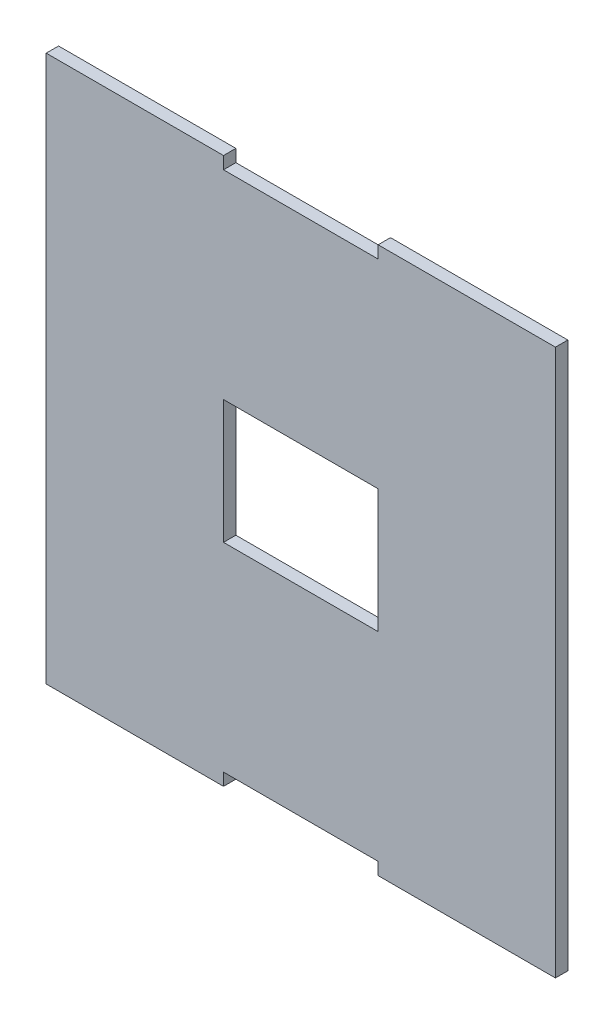
ISO-10303-21;
HEADER;
FILE_DESCRIPTION(('STEP AP214'),'2;1');
FILE_NAME('part.step','',(''),(''),'','','');
FILE_SCHEMA(('AUTOMOTIVE_DESIGN { 1 0 10303 214 1 1 1 1 }'));
ENDSEC;
DATA;
#1=APPLICATION_CONTEXT('core data for automotive mechanical design processes');
#2=APPLICATION_PROTOCOL_DEFINITION('international standard','automotive_design',2000,#1);
#3=PRODUCT_CONTEXT('',#1,'mechanical');
#4=PRODUCT('Part','Part','',(#3));
#5=PRODUCT_RELATED_PRODUCT_CATEGORY('part','',(#4));
#6=PRODUCT_DEFINITION_FORMATION('','',#4);
#7=PRODUCT_DEFINITION_CONTEXT('part definition',#1,'design');
#8=PRODUCT_DEFINITION('design','',#6,#7);
#9=PRODUCT_DEFINITION_SHAPE('','',#8);
#10=(LENGTH_UNIT() NAMED_UNIT(*) SI_UNIT(.MILLI.,.METRE.));
#11=(NAMED_UNIT(*) PLANE_ANGLE_UNIT() SI_UNIT($,.RADIAN.));
#12=(NAMED_UNIT(*) SI_UNIT($,.STERADIAN.) SOLID_ANGLE_UNIT());
#13=UNCERTAINTY_MEASURE_WITH_UNIT(LENGTH_MEASURE(1.E-05),#10,'distance_accuracy_value','');
#14=(GEOMETRIC_REPRESENTATION_CONTEXT(3) GLOBAL_UNCERTAINTY_ASSIGNED_CONTEXT((#13)) GLOBAL_UNIT_ASSIGNED_CONTEXT((#10,
#11,#12)) REPRESENTATION_CONTEXT('',''));
#15=CARTESIAN_POINT('',(0.,0.,0.));
#16=DIRECTION('',(0.,0.,1.));
#17=DIRECTION('',(1.,0.,0.));
#18=AXIS2_PLACEMENT_3D('',#15,#16,#17);
#19=CARTESIAN_POINT('',(0.,0.,6.));
#20=DIRECTION('',(0.,0.,-1.));
#21=DIRECTION('',(-1.,0.,0.));
#22=AXIS2_PLACEMENT_3D('',#19,#20,#21);
#23=PLANE('',#22);
#24=DIRECTION('',(0.,-1.,0.));
#25=VECTOR('',#24,1.);
#26=CARTESIAN_POINT('',(0.,0.,6.));
#27=LINE('',#26,#25);
#28=CARTESIAN_POINT('',(0.,265.,6.));
#29=VERTEX_POINT('',#28);
#30=CARTESIAN_POINT('',(0.,0.,6.));
#31=VERTEX_POINT('',#30);
#32=EDGE_CURVE('E201',#29,#31,#27,.T.);
#33=ORIENTED_EDGE('',*,*,#32,.T.);
#34=DIRECTION('',(1.,0.,0.));
#35=VECTOR('',#34,1.);
#36=CARTESIAN_POINT('',(0.,0.,6.));
#37=LINE('',#36,#35);
#38=CARTESIAN_POINT('',(86.,0.,6.));
#39=VERTEX_POINT('',#38);
#40=EDGE_CURVE('E205',#31,#39,#37,.T.);
#41=ORIENTED_EDGE('',*,*,#40,.T.);
#42=DIRECTION('',(0.,1.,0.));
#43=VECTOR('',#42,1.);
#44=CARTESIAN_POINT('',(86.,0.,6.));
#45=LINE('',#44,#43);
#46=CARTESIAN_POINT('',(86.,6.,6.));
#47=VERTEX_POINT('',#46);
#48=EDGE_CURVE('E209',#39,#47,#45,.T.);
#49=ORIENTED_EDGE('',*,*,#48,.T.);
#50=DIRECTION('',(1.,0.,0.));
#51=VECTOR('',#50,1.);
#52=CARTESIAN_POINT('',(86.,6.,6.));
#53=LINE('',#52,#51);
#54=CARTESIAN_POINT('',(161.,6.,6.));
#55=VERTEX_POINT('',#54);
#56=EDGE_CURVE('E212',#47,#55,#53,.T.);
#57=ORIENTED_EDGE('',*,*,#56,.T.);
#58=DIRECTION('',(0.,-1.,0.));
#59=VECTOR('',#58,1.);
#60=CARTESIAN_POINT('',(161.,0.,6.));
#61=LINE('',#60,#59);
#62=CARTESIAN_POINT('',(161.,0.,6.));
#63=VERTEX_POINT('',#62);
#64=EDGE_CURVE('E215',#55,#63,#61,.T.);
#65=ORIENTED_EDGE('',*,*,#64,.T.);
#66=DIRECTION('',(1.,0.,0.));
#67=VECTOR('',#66,1.);
#68=CARTESIAN_POINT('',(161.,0.,6.));
#69=LINE('',#68,#67);
#70=CARTESIAN_POINT('',(247.,0.,6.));
#71=VERTEX_POINT('',#70);
#72=EDGE_CURVE('E218',#63,#71,#69,.T.);
#73=ORIENTED_EDGE('',*,*,#72,.T.);
#74=DIRECTION('',(0.,1.,0.));
#75=VECTOR('',#74,1.);
#76=CARTESIAN_POINT('',(247.,0.,6.));
#77=LINE('',#76,#75);
#78=CARTESIAN_POINT('',(247.,265.,6.));
#79=VERTEX_POINT('',#78);
#80=EDGE_CURVE('E221',#71,#79,#77,.T.);
#81=ORIENTED_EDGE('',*,*,#80,.T.);
#82=DIRECTION('',(-1.,0.,0.));
#83=VECTOR('',#82,1.);
#84=CARTESIAN_POINT('',(161.,265.,6.));
#85=LINE('',#84,#83);
#86=CARTESIAN_POINT('',(161.,265.,6.));
#87=VERTEX_POINT('',#86);
#88=EDGE_CURVE('E224',#79,#87,#85,.T.);
#89=ORIENTED_EDGE('',*,*,#88,.T.);
#90=DIRECTION('',(0.,-1.,0.));
#91=VECTOR('',#90,1.);
#92=CARTESIAN_POINT('',(161.,265.,6.));
#93=LINE('',#92,#91);
#94=CARTESIAN_POINT('',(161.,259.,6.));
#95=VERTEX_POINT('',#94);
#96=EDGE_CURVE('E227',#87,#95,#93,.T.);
#97=ORIENTED_EDGE('',*,*,#96,.T.);
#98=DIRECTION('',(-1.,0.,0.));
#99=VECTOR('',#98,1.);
#100=CARTESIAN_POINT('',(86.,259.,6.));
#101=LINE('',#100,#99);
#102=CARTESIAN_POINT('',(86.,259.,6.));
#103=VERTEX_POINT('',#102);
#104=EDGE_CURVE('E230',#95,#103,#101,.T.);
#105=ORIENTED_EDGE('',*,*,#104,.T.);
#106=DIRECTION('',(0.,1.,0.));
#107=VECTOR('',#106,1.);
#108=CARTESIAN_POINT('',(86.,265.,6.));
#109=LINE('',#108,#107);
#110=CARTESIAN_POINT('',(86.,265.,6.));
#111=VERTEX_POINT('',#110);
#112=EDGE_CURVE('E233',#103,#111,#109,.T.);
#113=ORIENTED_EDGE('',*,*,#112,.T.);
#114=DIRECTION('',(-1.,0.,0.));
#115=VECTOR('',#114,1.);
#116=CARTESIAN_POINT('',(0.,265.,6.));
#117=LINE('',#116,#115);
#118=EDGE_CURVE('E236',#111,#29,#117,.T.);
#119=ORIENTED_EDGE('',*,*,#118,.T.);
#120=EDGE_LOOP('',(#33,#41,#49,#57,#65,#73,#81,#89,#97,#105,#113,#119));
#121=FACE_BOUND('',#120,.T.);
#122=DIRECTION('',(0.,-1.,0.));
#123=VECTOR('',#122,1.);
#124=CARTESIAN_POINT('',(86.,102.5,6.));
#125=LINE('',#124,#123);
#126=CARTESIAN_POINT('',(86.,162.5,6.));
#127=VERTEX_POINT('',#126);
#128=CARTESIAN_POINT('',(86.,102.5,6.));
#129=VERTEX_POINT('',#128);
#130=EDGE_CURVE('E153',#127,#129,#125,.T.);
#131=ORIENTED_EDGE('',*,*,#130,.F.);
#132=DIRECTION('',(-1.,0.,0.));
#133=VECTOR('',#132,1.);
#134=CARTESIAN_POINT('',(86.,162.5,6.));
#135=LINE('',#134,#133);
#136=CARTESIAN_POINT('',(161.,162.5,6.));
#137=VERTEX_POINT('',#136);
#138=EDGE_CURVE('E179',#137,#127,#135,.T.);
#139=ORIENTED_EDGE('',*,*,#138,.F.);
#140=DIRECTION('',(0.,1.,0.));
#141=VECTOR('',#140,1.);
#142=CARTESIAN_POINT('',(161.,102.5,6.));
#143=LINE('',#142,#141);
#144=CARTESIAN_POINT('',(161.,102.5,6.));
#145=VERTEX_POINT('',#144);
#146=EDGE_CURVE('E175',#145,#137,#143,.T.);
#147=ORIENTED_EDGE('',*,*,#146,.F.);
#148=DIRECTION('',(1.,0.,0.));
#149=VECTOR('',#148,1.);
#150=CARTESIAN_POINT('',(86.,102.5,6.));
#151=LINE('',#150,#149);
#152=EDGE_CURVE('E162',#129,#145,#151,.T.);
#153=ORIENTED_EDGE('',*,*,#152,.F.);
#154=EDGE_LOOP('',(#131,#139,#147,#153));
#155=FACE_BOUND('',#154,.T.);
#156=ADVANCED_FACE('F39',(#121,#155),#23,.F.);
#157=CARTESIAN_POINT('',(0.,0.,0.));
#158=DIRECTION('',(0.,0.,-1.));
#159=DIRECTION('',(-1.,0.,0.));
#160=AXIS2_PLACEMENT_3D('',#157,#158,#159);
#161=PLANE('',#160);
#162=DIRECTION('',(0.,-1.,0.));
#163=VECTOR('',#162,1.);
#164=CARTESIAN_POINT('',(0.,0.,0.));
#165=LINE('',#164,#163);
#166=CARTESIAN_POINT('',(0.,265.,0.));
#167=VERTEX_POINT('',#166);
#168=CARTESIAN_POINT('',(0.,0.,0.));
#169=VERTEX_POINT('',#168);
#170=EDGE_CURVE('E171',#167,#169,#165,.T.);
#171=ORIENTED_EDGE('',*,*,#170,.F.);
#172=DIRECTION('',(-1.,0.,0.));
#173=VECTOR('',#172,1.);
#174=CARTESIAN_POINT('',(0.,265.,0.));
#175=LINE('',#174,#173);
#176=CARTESIAN_POINT('',(86.,265.,0.));
#177=VERTEX_POINT('',#176);
#178=EDGE_CURVE('E206',#177,#167,#175,.T.);
#179=ORIENTED_EDGE('',*,*,#178,.F.);
#180=DIRECTION('',(0.,1.,0.));
#181=VECTOR('',#180,1.);
#182=CARTESIAN_POINT('',(86.,265.,0.));
#183=LINE('',#182,#181);
#184=CARTESIAN_POINT('',(86.,259.,0.));
#185=VERTEX_POINT('',#184);
#186=EDGE_CURVE('E270',#185,#177,#183,.T.);
#187=ORIENTED_EDGE('',*,*,#186,.F.);
#188=DIRECTION('',(-1.,0.,0.));
#189=VECTOR('',#188,1.);
#190=CARTESIAN_POINT('',(86.,259.,0.));
#191=LINE('',#190,#189);
#192=CARTESIAN_POINT('',(161.,259.,0.));
#193=VERTEX_POINT('',#192);
#194=EDGE_CURVE('E267',#193,#185,#191,.T.);
#195=ORIENTED_EDGE('',*,*,#194,.F.);
#196=DIRECTION('',(0.,-1.,0.));
#197=VECTOR('',#196,1.);
#198=CARTESIAN_POINT('',(161.,265.,0.));
#199=LINE('',#198,#197);
#200=CARTESIAN_POINT('',(161.,265.,0.));
#201=VERTEX_POINT('',#200);
#202=EDGE_CURVE('E264',#201,#193,#199,.T.);
#203=ORIENTED_EDGE('',*,*,#202,.F.);
#204=DIRECTION('',(-1.,0.,0.));
#205=VECTOR('',#204,1.);
#206=CARTESIAN_POINT('',(161.,265.,0.));
#207=LINE('',#206,#205);
#208=CARTESIAN_POINT('',(247.,265.,0.));
#209=VERTEX_POINT('',#208);
#210=EDGE_CURVE('E261',#209,#201,#207,.T.);
#211=ORIENTED_EDGE('',*,*,#210,.F.);
#212=DIRECTION('',(0.,1.,0.));
#213=VECTOR('',#212,1.);
#214=CARTESIAN_POINT('',(247.,0.,0.));
#215=LINE('',#214,#213);
#216=CARTESIAN_POINT('',(247.,0.,0.));
#217=VERTEX_POINT('',#216);
#218=EDGE_CURVE('E258',#217,#209,#215,.T.);
#219=ORIENTED_EDGE('',*,*,#218,.F.);
#220=DIRECTION('',(1.,0.,0.));
#221=VECTOR('',#220,1.);
#222=CARTESIAN_POINT('',(161.,0.,0.));
#223=LINE('',#222,#221);
#224=CARTESIAN_POINT('',(161.,0.,0.));
#225=VERTEX_POINT('',#224);
#226=EDGE_CURVE('E255',#225,#217,#223,.T.);
#227=ORIENTED_EDGE('',*,*,#226,.F.);
#228=DIRECTION('',(0.,-1.,0.));
#229=VECTOR('',#228,1.);
#230=CARTESIAN_POINT('',(161.,0.,0.));
#231=LINE('',#230,#229);
#232=CARTESIAN_POINT('',(161.,6.,0.));
#233=VERTEX_POINT('',#232);
#234=EDGE_CURVE('E252',#233,#225,#231,.T.);
#235=ORIENTED_EDGE('',*,*,#234,.F.);
#236=DIRECTION('',(1.,0.,0.));
#237=VECTOR('',#236,1.);
#238=CARTESIAN_POINT('',(86.,6.,0.));
#239=LINE('',#238,#237);
#240=CARTESIAN_POINT('',(86.,6.,0.));
#241=VERTEX_POINT('',#240);
#242=EDGE_CURVE('E249',#241,#233,#239,.T.);
#243=ORIENTED_EDGE('',*,*,#242,.F.);
#244=DIRECTION('',(0.,1.,0.));
#245=VECTOR('',#244,1.);
#246=CARTESIAN_POINT('',(86.,0.,0.));
#247=LINE('',#246,#245);
#248=CARTESIAN_POINT('',(86.,0.,0.));
#249=VERTEX_POINT('',#248);
#250=EDGE_CURVE('E246',#249,#241,#247,.T.);
#251=ORIENTED_EDGE('',*,*,#250,.F.);
#252=DIRECTION('',(1.,0.,0.));
#253=VECTOR('',#252,1.);
#254=CARTESIAN_POINT('',(0.,0.,0.));
#255=LINE('',#254,#253);
#256=EDGE_CURVE('E243',#169,#249,#255,.T.);
#257=ORIENTED_EDGE('',*,*,#256,.F.);
#258=EDGE_LOOP('',(#171,#179,#187,#195,#203,#211,#219,#227,#235,#243,#251,#257));
#259=FACE_BOUND('',#258,.T.);
#260=DIRECTION('',(-1.,0.,0.));
#261=VECTOR('',#260,1.);
#262=CARTESIAN_POINT('',(86.,162.5,0.));
#263=LINE('',#262,#261);
#264=CARTESIAN_POINT('',(161.,162.5,0.));
#265=VERTEX_POINT('',#264);
#266=CARTESIAN_POINT('',(86.,162.5,0.));
#267=VERTEX_POINT('',#266);
#268=EDGE_CURVE('E163',#265,#267,#263,.T.);
#269=ORIENTED_EDGE('',*,*,#268,.T.);
#270=DIRECTION('',(0.,-1.,0.));
#271=VECTOR('',#270,1.);
#272=CARTESIAN_POINT('',(86.,102.5,0.));
#273=LINE('',#272,#271);
#274=CARTESIAN_POINT('',(86.,102.5,0.));
#275=VERTEX_POINT('',#274);
#276=EDGE_CURVE('E63',#267,#275,#273,.T.);
#277=ORIENTED_EDGE('',*,*,#276,.T.);
#278=DIRECTION('',(1.,0.,0.));
#279=VECTOR('',#278,1.);
#280=CARTESIAN_POINT('',(86.,102.5,0.));
#281=LINE('',#280,#279);
#282=CARTESIAN_POINT('',(161.,102.5,0.));
#283=VERTEX_POINT('',#282);
#284=EDGE_CURVE('E169',#275,#283,#281,.T.);
#285=ORIENTED_EDGE('',*,*,#284,.T.);
#286=DIRECTION('',(0.,1.,0.));
#287=VECTOR('',#286,1.);
#288=CARTESIAN_POINT('',(161.,102.5,0.));
#289=LINE('',#288,#287);
#290=EDGE_CURVE('E188',#283,#265,#289,.T.);
#291=ORIENTED_EDGE('',*,*,#290,.T.);
#292=EDGE_LOOP('',(#269,#277,#285,#291));
#293=FACE_BOUND('',#292,.T.);
#294=ADVANCED_FACE('F325',(#259,#293),#161,.T.);
#295=CARTESIAN_POINT('',(0.,0.,6.));
#296=DIRECTION('',(1.,0.,0.));
#297=DIRECTION('',(0.,0.,-1.));
#298=AXIS2_PLACEMENT_3D('',#295,#296,#297);
#299=PLANE('',#298);
#300=ORIENTED_EDGE('',*,*,#170,.T.);
#301=DIRECTION('',(0.,0.,-1.));
#302=VECTOR('',#301,1.);
#303=CARTESIAN_POINT('',(0.,0.,6.));
#304=LINE('',#303,#302);
#305=EDGE_CURVE('E11',#31,#169,#304,.T.);
#306=ORIENTED_EDGE('',*,*,#305,.F.);
#307=ORIENTED_EDGE('',*,*,#32,.F.);
#308=DIRECTION('',(0.,0.,-1.));
#309=VECTOR('',#308,1.);
#310=CARTESIAN_POINT('',(0.,265.,6.));
#311=LINE('',#310,#309);
#312=EDGE_CURVE('E239',#29,#167,#311,.T.);
#313=ORIENTED_EDGE('',*,*,#312,.T.);
#314=EDGE_LOOP('',(#300,#306,#307,#313));
#315=FACE_BOUND('',#314,.T.);
#316=ADVANCED_FACE('F41',(#315),#299,.F.);
#317=CARTESIAN_POINT('',(0.,0.,6.));
#318=DIRECTION('',(0.,1.,0.));
#319=DIRECTION('',(0.,0.,1.));
#320=AXIS2_PLACEMENT_3D('',#317,#318,#319);
#321=PLANE('',#320);
#322=ORIENTED_EDGE('',*,*,#256,.T.);
#323=DIRECTION('',(0.,0.,-1.));
#324=VECTOR('',#323,1.);
#325=CARTESIAN_POINT('',(86.,0.,6.));
#326=LINE('',#325,#324);
#327=EDGE_CURVE('E48',#39,#249,#326,.T.);
#328=ORIENTED_EDGE('',*,*,#327,.F.);
#329=ORIENTED_EDGE('',*,*,#40,.F.);
#330=ORIENTED_EDGE('',*,*,#305,.T.);
#331=EDGE_LOOP('',(#322,#328,#329,#330));
#332=FACE_BOUND('',#331,.T.);
#333=ADVANCED_FACE('F342',(#332),#321,.F.);
#334=CARTESIAN_POINT('',(86.,0.,6.));
#335=DIRECTION('',(-1.,0.,0.));
#336=DIRECTION('',(0.,0.,1.));
#337=AXIS2_PLACEMENT_3D('',#334,#335,#336);
#338=PLANE('',#337);
#339=ORIENTED_EDGE('',*,*,#250,.T.);
#340=DIRECTION('',(0.,0.,-1.));
#341=VECTOR('',#340,1.);
#342=CARTESIAN_POINT('',(86.,6.,6.));
#343=LINE('',#342,#341);
#344=EDGE_CURVE('E310',#47,#241,#343,.T.);
#345=ORIENTED_EDGE('',*,*,#344,.F.);
#346=ORIENTED_EDGE('',*,*,#48,.F.);
#347=ORIENTED_EDGE('',*,*,#327,.T.);
#348=EDGE_LOOP('',(#339,#345,#346,#347));
#349=FACE_BOUND('',#348,.T.);
#350=ADVANCED_FACE('F319',(#349),#338,.F.);
#351=CARTESIAN_POINT('',(86.,6.,6.));
#352=DIRECTION('',(0.,1.,0.));
#353=DIRECTION('',(0.,0.,1.));
#354=AXIS2_PLACEMENT_3D('',#351,#352,#353);
#355=PLANE('',#354);
#356=ORIENTED_EDGE('',*,*,#242,.T.);
#357=DIRECTION('',(0.,0.,-1.));
#358=VECTOR('',#357,1.);
#359=CARTESIAN_POINT('',(161.,6.,6.));
#360=LINE('',#359,#358);
#361=EDGE_CURVE('E306',#55,#233,#360,.T.);
#362=ORIENTED_EDGE('',*,*,#361,.F.);
#363=ORIENTED_EDGE('',*,*,#56,.F.);
#364=ORIENTED_EDGE('',*,*,#344,.T.);
#365=EDGE_LOOP('',(#356,#362,#363,#364));
#366=FACE_BOUND('',#365,.T.);
#367=ADVANCED_FACE('F331',(#366),#355,.F.);
#368=CARTESIAN_POINT('',(161.,0.,6.));
#369=DIRECTION('',(1.,0.,0.));
#370=DIRECTION('',(0.,0.,-1.));
#371=AXIS2_PLACEMENT_3D('',#368,#369,#370);
#372=PLANE('',#371);
#373=ORIENTED_EDGE('',*,*,#234,.T.);
#374=DIRECTION('',(0.,0.,-1.));
#375=VECTOR('',#374,1.);
#376=CARTESIAN_POINT('',(161.,0.,6.));
#377=LINE('',#376,#375);
#378=EDGE_CURVE('E302',#63,#225,#377,.T.);
#379=ORIENTED_EDGE('',*,*,#378,.F.);
#380=ORIENTED_EDGE('',*,*,#64,.F.);
#381=ORIENTED_EDGE('',*,*,#361,.T.);
#382=EDGE_LOOP('',(#373,#379,#380,#381));
#383=FACE_BOUND('',#382,.T.);
#384=ADVANCED_FACE('F335',(#383),#372,.F.);
#385=CARTESIAN_POINT('',(161.,0.,6.));
#386=DIRECTION('',(0.,1.,0.));
#387=DIRECTION('',(0.,0.,1.));
#388=AXIS2_PLACEMENT_3D('',#385,#386,#387);
#389=PLANE('',#388);
#390=ORIENTED_EDGE('',*,*,#226,.T.);
#391=DIRECTION('',(0.,0.,-1.));
#392=VECTOR('',#391,1.);
#393=CARTESIAN_POINT('',(247.,0.,6.));
#394=LINE('',#393,#392);
#395=EDGE_CURVE('E298',#71,#217,#394,.T.);
#396=ORIENTED_EDGE('',*,*,#395,.F.);
#397=ORIENTED_EDGE('',*,*,#72,.F.);
#398=ORIENTED_EDGE('',*,*,#378,.T.);
#399=EDGE_LOOP('',(#390,#396,#397,#398));
#400=FACE_BOUND('',#399,.T.);
#401=ADVANCED_FACE('F375',(#400),#389,.F.);
#402=CARTESIAN_POINT('',(247.,0.,6.));
#403=DIRECTION('',(-1.,0.,0.));
#404=DIRECTION('',(0.,0.,1.));
#405=AXIS2_PLACEMENT_3D('',#402,#403,#404);
#406=PLANE('',#405);
#407=ORIENTED_EDGE('',*,*,#218,.T.);
#408=DIRECTION('',(0.,0.,-1.));
#409=VECTOR('',#408,1.);
#410=CARTESIAN_POINT('',(247.,265.,6.));
#411=LINE('',#410,#409);
#412=EDGE_CURVE('E294',#79,#209,#411,.T.);
#413=ORIENTED_EDGE('',*,*,#412,.F.);
#414=ORIENTED_EDGE('',*,*,#80,.F.);
#415=ORIENTED_EDGE('',*,*,#395,.T.);
#416=EDGE_LOOP('',(#407,#413,#414,#415));
#417=FACE_BOUND('',#416,.T.);
#418=ADVANCED_FACE('F373',(#417),#406,.F.);
#419=CARTESIAN_POINT('',(161.,265.,6.));
#420=DIRECTION('',(0.,-1.,0.));
#421=DIRECTION('',(0.,0.,-1.));
#422=AXIS2_PLACEMENT_3D('',#419,#420,#421);
#423=PLANE('',#422);
#424=ORIENTED_EDGE('',*,*,#210,.T.);
#425=DIRECTION('',(0.,0.,-1.));
#426=VECTOR('',#425,1.);
#427=CARTESIAN_POINT('',(161.,265.,6.));
#428=LINE('',#427,#426);
#429=EDGE_CURVE('E290',#87,#201,#428,.T.);
#430=ORIENTED_EDGE('',*,*,#429,.F.);
#431=ORIENTED_EDGE('',*,*,#88,.F.);
#432=ORIENTED_EDGE('',*,*,#412,.T.);
#433=EDGE_LOOP('',(#424,#430,#431,#432));
#434=FACE_BOUND('',#433,.T.);
#435=ADVANCED_FACE('F369',(#434),#423,.F.);
#436=CARTESIAN_POINT('',(161.,265.,6.));
#437=DIRECTION('',(1.,0.,0.));
#438=DIRECTION('',(0.,0.,-1.));
#439=AXIS2_PLACEMENT_3D('',#436,#437,#438);
#440=PLANE('',#439);
#441=ORIENTED_EDGE('',*,*,#202,.T.);
#442=DIRECTION('',(0.,0.,-1.));
#443=VECTOR('',#442,1.);
#444=CARTESIAN_POINT('',(161.,259.,6.));
#445=LINE('',#444,#443);
#446=EDGE_CURVE('E286',#95,#193,#445,.T.);
#447=ORIENTED_EDGE('',*,*,#446,.F.);
#448=ORIENTED_EDGE('',*,*,#96,.F.);
#449=ORIENTED_EDGE('',*,*,#429,.T.);
#450=EDGE_LOOP('',(#441,#447,#448,#449));
#451=FACE_BOUND('',#450,.T.);
#452=ADVANCED_FACE('F364',(#451),#440,.F.);
#453=CARTESIAN_POINT('',(86.,259.,6.));
#454=DIRECTION('',(0.,-1.,0.));
#455=DIRECTION('',(0.,0.,-1.));
#456=AXIS2_PLACEMENT_3D('',#453,#454,#455);
#457=PLANE('',#456);
#458=ORIENTED_EDGE('',*,*,#194,.T.);
#459=DIRECTION('',(0.,0.,-1.));
#460=VECTOR('',#459,1.);
#461=CARTESIAN_POINT('',(86.,259.,6.));
#462=LINE('',#461,#460);
#463=EDGE_CURVE('E282',#103,#185,#462,.T.);
#464=ORIENTED_EDGE('',*,*,#463,.F.);
#465=ORIENTED_EDGE('',*,*,#104,.F.);
#466=ORIENTED_EDGE('',*,*,#446,.T.);
#467=EDGE_LOOP('',(#458,#464,#465,#466));
#468=FACE_BOUND('',#467,.T.);
#469=ADVANCED_FACE('F358',(#468),#457,.F.);
#470=CARTESIAN_POINT('',(86.,265.,6.));
#471=DIRECTION('',(-1.,0.,0.));
#472=DIRECTION('',(0.,0.,1.));
#473=AXIS2_PLACEMENT_3D('',#470,#471,#472);
#474=PLANE('',#473);
#475=ORIENTED_EDGE('',*,*,#186,.T.);
#476=DIRECTION('',(0.,0.,-1.));
#477=VECTOR('',#476,1.);
#478=CARTESIAN_POINT('',(86.,265.,6.));
#479=LINE('',#478,#477);
#480=EDGE_CURVE('E278',#111,#177,#479,.T.);
#481=ORIENTED_EDGE('',*,*,#480,.F.);
#482=ORIENTED_EDGE('',*,*,#112,.F.);
#483=ORIENTED_EDGE('',*,*,#463,.T.);
#484=EDGE_LOOP('',(#475,#481,#482,#483));
#485=FACE_BOUND('',#484,.T.);
#486=ADVANCED_FACE('F354',(#485),#474,.F.);
#487=CARTESIAN_POINT('',(0.,265.,6.));
#488=DIRECTION('',(0.,-1.,0.));
#489=DIRECTION('',(0.,0.,-1.));
#490=AXIS2_PLACEMENT_3D('',#487,#488,#489);
#491=PLANE('',#490);
#492=ORIENTED_EDGE('',*,*,#178,.T.);
#493=ORIENTED_EDGE('',*,*,#312,.F.);
#494=ORIENTED_EDGE('',*,*,#118,.F.);
#495=ORIENTED_EDGE('',*,*,#480,.T.);
#496=EDGE_LOOP('',(#492,#493,#494,#495));
#497=FACE_BOUND('',#496,.T.);
#498=ADVANCED_FACE('F349',(#497),#491,.F.);
#499=CARTESIAN_POINT('',(86.,102.5,6.));
#500=DIRECTION('',(1.,0.,0.));
#501=DIRECTION('',(0.,0.,-1.));
#502=AXIS2_PLACEMENT_3D('',#499,#500,#501);
#503=PLANE('',#502);
#504=ORIENTED_EDGE('',*,*,#276,.F.);
#505=DIRECTION('',(0.,0.,-1.));
#506=VECTOR('',#505,1.);
#507=CARTESIAN_POINT('',(86.,162.5,6.));
#508=LINE('',#507,#506);
#509=EDGE_CURVE('E157',#127,#267,#508,.T.);
#510=ORIENTED_EDGE('',*,*,#509,.F.);
#511=ORIENTED_EDGE('',*,*,#130,.T.);
#512=DIRECTION('',(0.,0.,-1.));
#513=VECTOR('',#512,1.);
#514=CARTESIAN_POINT('',(86.,102.5,6.));
#515=LINE('',#514,#513);
#516=EDGE_CURVE('E156',#129,#275,#515,.T.);
#517=ORIENTED_EDGE('',*,*,#516,.T.);
#518=EDGE_LOOP('',(#504,#510,#511,#517));
#519=FACE_BOUND('',#518,.T.);
#520=ADVANCED_FACE('F155',(#519),#503,.T.);
#521=CARTESIAN_POINT('',(86.,102.5,6.));
#522=DIRECTION('',(0.,1.,0.));
#523=DIRECTION('',(0.,0.,1.));
#524=AXIS2_PLACEMENT_3D('',#521,#522,#523);
#525=PLANE('',#524);
#526=ORIENTED_EDGE('',*,*,#284,.F.);
#527=ORIENTED_EDGE('',*,*,#516,.F.);
#528=ORIENTED_EDGE('',*,*,#152,.T.);
#529=DIRECTION('',(0.,0.,-1.));
#530=VECTOR('',#529,1.);
#531=CARTESIAN_POINT('',(161.,102.5,6.));
#532=LINE('',#531,#530);
#533=EDGE_CURVE('E172',#145,#283,#532,.T.);
#534=ORIENTED_EDGE('',*,*,#533,.T.);
#535=EDGE_LOOP('',(#526,#527,#528,#534));
#536=FACE_BOUND('',#535,.T.);
#537=ADVANCED_FACE('F166',(#536),#525,.T.);
#538=CARTESIAN_POINT('',(161.,102.5,6.));
#539=DIRECTION('',(-1.,0.,0.));
#540=DIRECTION('',(0.,0.,1.));
#541=AXIS2_PLACEMENT_3D('',#538,#539,#540);
#542=PLANE('',#541);
#543=ORIENTED_EDGE('',*,*,#290,.F.);
#544=ORIENTED_EDGE('',*,*,#533,.F.);
#545=ORIENTED_EDGE('',*,*,#146,.T.);
#546=DIRECTION('',(0.,0.,-1.));
#547=VECTOR('',#546,1.);
#548=CARTESIAN_POINT('',(161.,162.5,6.));
#549=LINE('',#548,#547);
#550=EDGE_CURVE('E55',#137,#265,#549,.T.);
#551=ORIENTED_EDGE('',*,*,#550,.T.);
#552=EDGE_LOOP('',(#543,#544,#545,#551));
#553=FACE_BOUND('',#552,.T.);
#554=ADVANCED_FACE('F433',(#553),#542,.T.);
#555=CARTESIAN_POINT('',(86.,162.5,6.));
#556=DIRECTION('',(0.,-1.,0.));
#557=DIRECTION('',(0.,0.,-1.));
#558=AXIS2_PLACEMENT_3D('',#555,#556,#557);
#559=PLANE('',#558);
#560=ORIENTED_EDGE('',*,*,#268,.F.);
#561=ORIENTED_EDGE('',*,*,#550,.F.);
#562=ORIENTED_EDGE('',*,*,#138,.T.);
#563=ORIENTED_EDGE('',*,*,#509,.T.);
#564=EDGE_LOOP('',(#560,#561,#562,#563));
#565=FACE_BOUND('',#564,.T.);
#566=ADVANCED_FACE('F439',(#565),#559,.T.);
#567=CLOSED_SHELL('',(#156,#294,#316,#333,#350,#367,#384,#401,#418,#435,#452,#469,#486,#498,
#520,#537,#554,#566));
#568=MANIFOLD_SOLID_BREP('B2',#567);
#569=ADVANCED_BREP_SHAPE_REPRESENTATION('',(#18,#568),#14);
#570=SHAPE_DEFINITION_REPRESENTATION(#9,#569);
ENDSEC;
END-ISO-10303-21;
